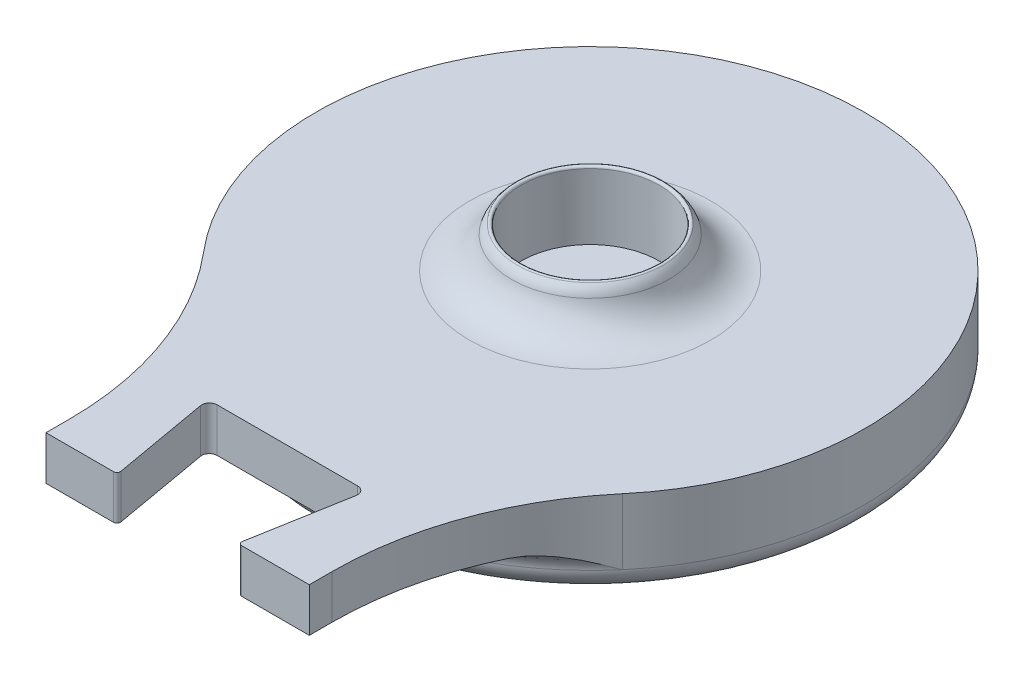
ISO-10303-21;
HEADER;
FILE_DESCRIPTION(('STEP AP214'),'2;1');
FILE_NAME('part.step','',(''),(''),'','','');
FILE_SCHEMA(('AUTOMOTIVE_DESIGN { 1 0 10303 214 1 1 1 1 }'));
ENDSEC;
DATA;
#1=APPLICATION_CONTEXT('core data for automotive mechanical design processes');
#2=APPLICATION_PROTOCOL_DEFINITION('international standard','automotive_design',2000,#1);
#3=PRODUCT_CONTEXT('',#1,'mechanical');
#4=PRODUCT('Part','Part','',(#3));
#5=PRODUCT_RELATED_PRODUCT_CATEGORY('part','',(#4));
#6=PRODUCT_DEFINITION_FORMATION('','',#4);
#7=PRODUCT_DEFINITION_CONTEXT('part definition',#1,'design');
#8=PRODUCT_DEFINITION('design','',#6,#7);
#9=PRODUCT_DEFINITION_SHAPE('','',#8);
#10=(LENGTH_UNIT() NAMED_UNIT(*) SI_UNIT(.MILLI.,.METRE.));
#11=(NAMED_UNIT(*) PLANE_ANGLE_UNIT() SI_UNIT($,.RADIAN.));
#12=(NAMED_UNIT(*) SI_UNIT($,.STERADIAN.) SOLID_ANGLE_UNIT());
#13=UNCERTAINTY_MEASURE_WITH_UNIT(LENGTH_MEASURE(1.E-05),#10,'distance_accuracy_value','');
#14=(GEOMETRIC_REPRESENTATION_CONTEXT(3) GLOBAL_UNCERTAINTY_ASSIGNED_CONTEXT((#13)) GLOBAL_UNIT_ASSIGNED_CONTEXT((#10,
#11,#12)) REPRESENTATION_CONTEXT('',''));
#15=CARTESIAN_POINT('',(0.,0.,0.));
#16=DIRECTION('',(0.,0.,1.));
#17=DIRECTION('',(1.,0.,0.));
#18=AXIS2_PLACEMENT_3D('',#15,#16,#17);
#19=CARTESIAN_POINT('',(0.,0.,0.));
#20=DIRECTION('',(0.,1.,0.));
#21=DIRECTION('',(0.,0.,1.));
#22=AXIS2_PLACEMENT_3D('',#19,#20,#21);
#23=PLANE('',#22);
#24=CARTESIAN_POINT('',(-21.,0.,17.7552809045647));
#25=DIRECTION('',(0.,1.,0.));
#26=DIRECTION('',(0.,0.,1.));
#27=AXIS2_PLACEMENT_3D('',#24,#25,#26);
#28=CIRCLE('',#27,15.);
#29=CARTESIAN_POINT('',(-6.,0.,17.7552809045647));
#30=VERTEX_POINT('',#29);
#31=CARTESIAN_POINT('',(-7.49425440352589,0.,11.2288089722478));
#32=VERTEX_POINT('',#31);
#33=EDGE_CURVE('E233',#30,#32,#28,.T.);
#34=ORIENTED_EDGE('',*,*,#33,.T.);
#35=CARTESIAN_POINT('',(0.,0.,0.));
#36=DIRECTION('',(0.,1.,0.));
#37=DIRECTION('',(0.,0.,1.));
#38=AXIS2_PLACEMENT_3D('',#35,#36,#37);
#39=CIRCLE('',#38,13.5);
#40=CARTESIAN_POINT('',(7.49425440352589,0.,11.2288089722478));
#41=VERTEX_POINT('',#40);
#42=EDGE_CURVE('E55',#32,#41,#39,.T.);
#43=ORIENTED_EDGE('',*,*,#42,.T.);
#44=CARTESIAN_POINT('',(21.,0.,17.7552809045647));
#45=DIRECTION('',(0.,1.,0.));
#46=DIRECTION('',(0.,0.,1.));
#47=AXIS2_PLACEMENT_3D('',#44,#45,#46);
#48=CIRCLE('',#47,15.);
#49=CARTESIAN_POINT('',(6.,0.,17.7552809045647));
#50=VERTEX_POINT('',#49);
#51=EDGE_CURVE('E237',#41,#50,#48,.T.);
#52=ORIENTED_EDGE('',*,*,#51,.T.);
#53=DIRECTION('',(0.,0.,-1.));
#54=VECTOR('',#53,1.);
#55=CARTESIAN_POINT('',(6.,0.,13.2915026221292));
#56=LINE('',#55,#54);
#57=CARTESIAN_POINT('',(6.,0.,18.8));
#58=VERTEX_POINT('',#57);
#59=EDGE_CURVE('E186',#58,#50,#56,.T.);
#60=ORIENTED_EDGE('',*,*,#59,.F.);
#61=DIRECTION('',(-1.,0.,0.));
#62=VECTOR('',#61,1.);
#63=CARTESIAN_POINT('',(0.,0.,18.8));
#64=LINE('',#63,#62);
#65=CARTESIAN_POINT('',(2.91630349460621,0.,18.8));
#66=VERTEX_POINT('',#65);
#67=EDGE_CURVE('E147',#58,#66,#64,.T.);
#68=ORIENTED_EDGE('',*,*,#67,.T.);
#69=CARTESIAN_POINT('',(2.91630349460621,0.,18.65));
#70=DIRECTION('',(0.,1.,0.));
#71=DIRECTION('',(0.,0.,1.));
#72=AXIS2_PLACEMENT_3D('',#69,#70,#71);
#73=CIRCLE('',#72,0.15);
#74=CARTESIAN_POINT('',(2.76858233165438,0.,18.62395277335));
#75=VERTEX_POINT('',#74);
#76=EDGE_CURVE('E219',#66,#75,#73,.F.);
#77=ORIENTED_EDGE('',*,*,#76,.T.);
#78=DIRECTION('',(-0.173648177666934,0.,0.984807753012207));
#79=VECTOR('',#78,1.);
#80=CARTESIAN_POINT('',(2.70227505957538,0.,19.));
#81=LINE('',#80,#79);
#82=CARTESIAN_POINT('',(3.54674431540572,0.,14.2107768621834));
#83=VERTEX_POINT('',#82);
#84=EDGE_CURVE('E183',#83,#75,#81,.T.);
#85=ORIENTED_EDGE('',*,*,#84,.F.);
#86=CARTESIAN_POINT('',(3.20206160185145,0.,14.15));
#87=DIRECTION('',(0.,1.,0.));
#88=DIRECTION('',(0.,0.,1.));
#89=AXIS2_PLACEMENT_3D('',#86,#87,#88);
#90=CIRCLE('',#89,0.35);
#91=CARTESIAN_POINT('',(3.20206160185145,0.,13.8));
#92=VERTEX_POINT('',#91);
#93=EDGE_CURVE('E200',#83,#92,#90,.T.);
#94=ORIENTED_EDGE('',*,*,#93,.T.);
#95=DIRECTION('',(1.,0.,0.));
#96=VECTOR('',#95,1.);
#97=CARTESIAN_POINT('',(3.61917535925942,0.,13.8));
#98=LINE('',#97,#96);
#99=CARTESIAN_POINT('',(-3.20206160185144,0.,13.8));
#100=VERTEX_POINT('',#99);
#101=EDGE_CURVE('E180',#100,#92,#98,.T.);
#102=ORIENTED_EDGE('',*,*,#101,.F.);
#103=CARTESIAN_POINT('',(-3.20206160185145,0.,14.15));
#104=DIRECTION('',(0.,1.,0.));
#105=DIRECTION('',(0.,0.,1.));
#106=AXIS2_PLACEMENT_3D('',#103,#104,#105);
#107=CIRCLE('',#106,0.35);
#108=CARTESIAN_POINT('',(-3.54674431540572,0.,14.2107768621834));
#109=VERTEX_POINT('',#108);
#110=EDGE_CURVE('E204',#100,#109,#107,.T.);
#111=ORIENTED_EDGE('',*,*,#110,.T.);
#112=DIRECTION('',(-0.173648177666935,0.,-0.984807753012207));
#113=VECTOR('',#112,1.);
#114=CARTESIAN_POINT('',(-2.70227505957538,0.,19.));
#115=LINE('',#114,#113);
#116=CARTESIAN_POINT('',(-2.76858233165438,0.,18.62395277335));
#117=VERTEX_POINT('',#116);
#118=EDGE_CURVE('E177',#117,#109,#115,.T.);
#119=ORIENTED_EDGE('',*,*,#118,.F.);
#120=CARTESIAN_POINT('',(-2.91630349460621,0.,18.65));
#121=DIRECTION('',(0.,1.,0.));
#122=DIRECTION('',(0.,0.,1.));
#123=AXIS2_PLACEMENT_3D('',#120,#121,#122);
#124=CIRCLE('',#123,0.15);
#125=CARTESIAN_POINT('',(-2.91630349460621,0.,18.8));
#126=VERTEX_POINT('',#125);
#127=EDGE_CURVE('E217',#117,#126,#124,.F.);
#128=ORIENTED_EDGE('',*,*,#127,.T.);
#129=CARTESIAN_POINT('',(-6.,0.,18.8));
#130=VERTEX_POINT('',#129);
#131=EDGE_CURVE('E166',#126,#130,#64,.T.);
#132=ORIENTED_EDGE('',*,*,#131,.T.);
#133=DIRECTION('',(0.,0.,1.));
#134=VECTOR('',#133,1.);
#135=CARTESIAN_POINT('',(-6.,0.,13.2915026221292));
#136=LINE('',#135,#134);
#137=EDGE_CURVE('E175',#30,#130,#136,.T.);
#138=ORIENTED_EDGE('',*,*,#137,.F.);
#139=EDGE_LOOP('',(#34,#43,#52,#60,#68,#77,#85,#94,#102,#111,#119,#128,#132,#138));
#140=FACE_BOUND('',#139,.T.);
#141=ADVANCED_FACE('F33',(#140),#23,.F.);
#142=CARTESIAN_POINT('',(0.,2.,0.));
#143=DIRECTION('',(0.,1.,0.));
#144=DIRECTION('',(0.,0.,1.));
#145=AXIS2_PLACEMENT_3D('',#142,#143,#144);
#146=PLANE('',#145);
#147=CARTESIAN_POINT('',(0.,2.,0.));
#148=DIRECTION('',(0.,1.,0.));
#149=DIRECTION('',(0.,0.,1.));
#150=AXIS2_PLACEMENT_3D('',#147,#148,#149);
#151=CIRCLE('',#150,5.5);
#152=CARTESIAN_POINT('',(0.,2.,5.5));
#153=VERTEX_POINT('',#152);
#154=EDGE_CURVE('E236',#153,#153,#151,.F.);
#155=ORIENTED_EDGE('',*,*,#154,.T.);
#156=EDGE_LOOP('',(#155));
#157=FACE_BOUND('',#156,.T.);
#158=DIRECTION('',(-0.173648177666934,0.,0.984807753012207));
#159=VECTOR('',#158,1.);
#160=CARTESIAN_POINT('',(2.70227505957538,2.,19.));
#161=LINE('',#160,#159);
#162=CARTESIAN_POINT('',(3.54674431540572,2.,14.2107768621834));
#163=VERTEX_POINT('',#162);
#164=CARTESIAN_POINT('',(2.76858233165438,2.,18.62395277335));
#165=VERTEX_POINT('',#164);
#166=EDGE_CURVE('E167',#163,#165,#161,.T.);
#167=ORIENTED_EDGE('',*,*,#166,.T.);
#168=CARTESIAN_POINT('',(2.91630349460621,2.,18.65));
#169=DIRECTION('',(0.,1.,0.));
#170=DIRECTION('',(0.,0.,1.));
#171=AXIS2_PLACEMENT_3D('',#168,#169,#170);
#172=CIRCLE('',#171,0.15);
#173=CARTESIAN_POINT('',(2.91630349460621,2.,18.8));
#174=VERTEX_POINT('',#173);
#175=EDGE_CURVE('E160',#165,#174,#172,.T.);
#176=ORIENTED_EDGE('',*,*,#175,.T.);
#177=DIRECTION('',(-1.,0.,0.));
#178=VECTOR('',#177,1.);
#179=CARTESIAN_POINT('',(-6.,2.,18.8));
#180=LINE('',#179,#178);
#181=CARTESIAN_POINT('',(6.,2.,18.8));
#182=VERTEX_POINT('',#181);
#183=EDGE_CURVE('E144',#182,#174,#180,.T.);
#184=ORIENTED_EDGE('',*,*,#183,.F.);
#185=DIRECTION('',(0.,0.,-1.));
#186=VECTOR('',#185,1.);
#187=CARTESIAN_POINT('',(6.,2.,19.));
#188=LINE('',#187,#186);
#189=CARTESIAN_POINT('',(6.,2.,17.7552809045647));
#190=VERTEX_POINT('',#189);
#191=EDGE_CURVE('E158',#182,#190,#188,.T.);
#192=ORIENTED_EDGE('',*,*,#191,.T.);
#193=CARTESIAN_POINT('',(21.,2.,17.7552809045647));
#194=DIRECTION('',(0.,1.,0.));
#195=DIRECTION('',(0.,0.,1.));
#196=AXIS2_PLACEMENT_3D('',#193,#194,#195);
#197=CIRCLE('',#196,15.);
#198=CARTESIAN_POINT('',(9.54545454545454,2.,8.0705822293476));
#199=VERTEX_POINT('',#198);
#200=EDGE_CURVE('E234',#190,#199,#197,.F.);
#201=ORIENTED_EDGE('',*,*,#200,.T.);
#202=CARTESIAN_POINT('',(0.,2.,0.));
#203=DIRECTION('',(0.,1.,0.));
#204=DIRECTION('',(0.,0.,1.));
#205=AXIS2_PLACEMENT_3D('',#202,#203,#204);
#206=CIRCLE('',#205,12.5);
#207=CARTESIAN_POINT('',(-9.54545454545454,2.,8.0705822293476));
#208=VERTEX_POINT('',#207);
#209=EDGE_CURVE('E178',#199,#208,#206,.T.);
#210=ORIENTED_EDGE('',*,*,#209,.T.);
#211=CARTESIAN_POINT('',(-21.,2.,17.7552809045647));
#212=DIRECTION('',(0.,1.,0.));
#213=DIRECTION('',(0.,0.,1.));
#214=AXIS2_PLACEMENT_3D('',#211,#212,#213);
#215=CIRCLE('',#214,15.);
#216=CARTESIAN_POINT('',(-6.,2.,17.7552809045647));
#217=VERTEX_POINT('',#216);
#218=EDGE_CURVE('E231',#208,#217,#215,.F.);
#219=ORIENTED_EDGE('',*,*,#218,.T.);
#220=DIRECTION('',(0.,0.,1.));
#221=VECTOR('',#220,1.);
#222=CARTESIAN_POINT('',(-6.,2.,-6.));
#223=LINE('',#222,#221);
#224=CARTESIAN_POINT('',(-6.,2.,18.8));
#225=VERTEX_POINT('',#224);
#226=EDGE_CURVE('E187',#217,#225,#223,.T.);
#227=ORIENTED_EDGE('',*,*,#226,.T.);
#228=CARTESIAN_POINT('',(-2.91630349460621,2.,18.8));
#229=VERTEX_POINT('',#228);
#230=EDGE_CURVE('E161',#229,#225,#180,.T.);
#231=ORIENTED_EDGE('',*,*,#230,.F.);
#232=CARTESIAN_POINT('',(-2.91630349460621,2.,18.65));
#233=DIRECTION('',(0.,1.,0.));
#234=DIRECTION('',(0.,0.,1.));
#235=AXIS2_PLACEMENT_3D('',#232,#233,#234);
#236=CIRCLE('',#235,0.15);
#237=CARTESIAN_POINT('',(-2.76858233165438,2.,18.62395277335));
#238=VERTEX_POINT('',#237);
#239=EDGE_CURVE('E212',#229,#238,#236,.T.);
#240=ORIENTED_EDGE('',*,*,#239,.T.);
#241=DIRECTION('',(-0.173648177666935,0.,-0.984807753012207));
#242=VECTOR('',#241,1.);
#243=CARTESIAN_POINT('',(-2.70227505957538,2.,19.));
#244=LINE('',#243,#242);
#245=CARTESIAN_POINT('',(-3.54674431540572,2.,14.2107768621834));
#246=VERTEX_POINT('',#245);
#247=EDGE_CURVE('E354',#238,#246,#244,.T.);
#248=ORIENTED_EDGE('',*,*,#247,.T.);
#249=CARTESIAN_POINT('',(-3.20206160185145,2.,14.15));
#250=DIRECTION('',(0.,1.,0.));
#251=DIRECTION('',(0.,0.,1.));
#252=AXIS2_PLACEMENT_3D('',#249,#250,#251);
#253=CIRCLE('',#252,0.35);
#254=CARTESIAN_POINT('',(-3.20206160185145,2.,13.8));
#255=VERTEX_POINT('',#254);
#256=EDGE_CURVE('E207',#246,#255,#253,.F.);
#257=ORIENTED_EDGE('',*,*,#256,.T.);
#258=DIRECTION('',(1.,0.,0.));
#259=VECTOR('',#258,1.);
#260=CARTESIAN_POINT('',(-3.61917535925942,2.,13.8));
#261=LINE('',#260,#259);
#262=CARTESIAN_POINT('',(3.20206160185144,2.,13.8));
#263=VERTEX_POINT('',#262);
#264=EDGE_CURVE('E171',#255,#263,#261,.T.);
#265=ORIENTED_EDGE('',*,*,#264,.T.);
#266=CARTESIAN_POINT('',(3.20206160185145,2.,14.15));
#267=DIRECTION('',(0.,1.,0.));
#268=DIRECTION('',(0.,0.,1.));
#269=AXIS2_PLACEMENT_3D('',#266,#267,#268);
#270=CIRCLE('',#269,0.35);
#271=EDGE_CURVE('E202',#263,#163,#270,.F.);
#272=ORIENTED_EDGE('',*,*,#271,.T.);
#273=EDGE_LOOP('',(#167,#176,#184,#192,#201,#210,#219,#227,#231,#240,#248,#257,#265,#272));
#274=FACE_BOUND('',#273,.T.);
#275=ADVANCED_FACE('F157',(#157,#274),#146,.T.);
#276=CARTESIAN_POINT('',(-6.,2.,13.2915026221292));
#277=DIRECTION('',(1.,0.,0.));
#278=DIRECTION('',(0.,0.,-1.));
#279=AXIS2_PLACEMENT_3D('',#276,#277,#278);
#280=PLANE('',#279);
#281=ORIENTED_EDGE('',*,*,#226,.F.);
#282=DIRECTION('',(0.,1.,0.));
#283=VECTOR('',#282,1.);
#284=CARTESIAN_POINT('',(-6.,0.,17.7552809045647));
#285=LINE('',#284,#283);
#286=EDGE_CURVE('E227',#217,#30,#285,.F.);
#287=ORIENTED_EDGE('',*,*,#286,.T.);
#288=ORIENTED_EDGE('',*,*,#137,.T.);
#289=DIRECTION('',(0.,1.,0.));
#290=VECTOR('',#289,1.);
#291=CARTESIAN_POINT('',(-6.,-2.,18.8));
#292=LINE('',#291,#290);
#293=EDGE_CURVE('E152',#130,#225,#292,.T.);
#294=ORIENTED_EDGE('',*,*,#293,.T.);
#295=EDGE_LOOP('',(#281,#287,#288,#294));
#296=FACE_BOUND('',#295,.T.);
#297=ADVANCED_FACE('F316',(#296),#280,.F.);
#298=CARTESIAN_POINT('',(6.,2.,13.2915026221292));
#299=DIRECTION('',(-1.,0.,0.));
#300=DIRECTION('',(0.,0.,1.));
#301=AXIS2_PLACEMENT_3D('',#298,#299,#300);
#302=PLANE('',#301);
#303=ORIENTED_EDGE('',*,*,#59,.T.);
#304=DIRECTION('',(0.,1.,0.));
#305=VECTOR('',#304,1.);
#306=CARTESIAN_POINT('',(6.,2.,17.7552809045647));
#307=LINE('',#306,#305);
#308=EDGE_CURVE('E165',#50,#190,#307,.T.);
#309=ORIENTED_EDGE('',*,*,#308,.T.);
#310=ORIENTED_EDGE('',*,*,#191,.F.);
#311=DIRECTION('',(0.,1.,0.));
#312=VECTOR('',#311,1.);
#313=CARTESIAN_POINT('',(6.,-2.,18.8));
#314=LINE('',#313,#312);
#315=EDGE_CURVE('E141',#58,#182,#314,.T.);
#316=ORIENTED_EDGE('',*,*,#315,.F.);
#317=EDGE_LOOP('',(#303,#309,#310,#316));
#318=FACE_BOUND('',#317,.T.);
#319=ADVANCED_FACE('F163',(#318),#302,.F.);
#320=CARTESIAN_POINT('',(-2.70227505957538,2.,19.));
#321=DIRECTION('',(-0.984807753012207,0.,0.173648177666935));
#322=DIRECTION('',(0.173648177666935,0.,0.984807753012207));
#323=AXIS2_PLACEMENT_3D('',#320,#321,#322);
#324=PLANE('',#323);
#325=ORIENTED_EDGE('',*,*,#247,.F.);
#326=DIRECTION('',(0.,-1.,0.));
#327=VECTOR('',#326,1.);
#328=CARTESIAN_POINT('',(-2.76858233165438,2.,18.62395277335));
#329=LINE('',#328,#327);
#330=EDGE_CURVE('E221',#238,#117,#329,.T.);
#331=ORIENTED_EDGE('',*,*,#330,.T.);
#332=ORIENTED_EDGE('',*,*,#118,.T.);
#333=DIRECTION('',(0.,-1.,0.));
#334=VECTOR('',#333,1.);
#335=CARTESIAN_POINT('',(-3.54674431540572,2.,14.2107768621834));
#336=LINE('',#335,#334);
#337=EDGE_CURVE('E197',#109,#246,#336,.F.);
#338=ORIENTED_EDGE('',*,*,#337,.T.);
#339=EDGE_LOOP('',(#325,#331,#332,#338));
#340=FACE_BOUND('',#339,.T.);
#341=ADVANCED_FACE('F389',(#340),#324,.F.);
#342=CARTESIAN_POINT('',(3.61917535925942,2.,13.8));
#343=DIRECTION('',(0.,0.,-1.));
#344=DIRECTION('',(-1.,0.,0.));
#345=AXIS2_PLACEMENT_3D('',#342,#343,#344);
#346=PLANE('',#345);
#347=ORIENTED_EDGE('',*,*,#101,.T.);
#348=DIRECTION('',(0.,-1.,0.));
#349=VECTOR('',#348,1.);
#350=CARTESIAN_POINT('',(3.20206160185145,2.,13.8));
#351=LINE('',#350,#349);
#352=EDGE_CURVE('E195',#92,#263,#351,.F.);
#353=ORIENTED_EDGE('',*,*,#352,.T.);
#354=ORIENTED_EDGE('',*,*,#264,.F.);
#355=DIRECTION('',(0.,-1.,0.));
#356=VECTOR('',#355,1.);
#357=CARTESIAN_POINT('',(-3.20206160185145,0.,13.8));
#358=LINE('',#357,#356);
#359=EDGE_CURVE('E192',#255,#100,#358,.T.);
#360=ORIENTED_EDGE('',*,*,#359,.T.);
#361=EDGE_LOOP('',(#347,#353,#354,#360));
#362=FACE_BOUND('',#361,.T.);
#363=ADVANCED_FACE('F392',(#362),#346,.F.);
#364=CARTESIAN_POINT('',(2.70227505957538,2.,19.));
#365=DIRECTION('',(0.984807753012207,0.,0.173648177666934));
#366=DIRECTION('',(0.173648177666934,0.,-0.984807753012207));
#367=AXIS2_PLACEMENT_3D('',#364,#365,#366);
#368=PLANE('',#367);
#369=ORIENTED_EDGE('',*,*,#84,.T.);
#370=DIRECTION('',(0.,1.,0.));
#371=VECTOR('',#370,1.);
#372=CARTESIAN_POINT('',(2.76858233165438,2.,18.62395277335));
#373=LINE('',#372,#371);
#374=EDGE_CURVE('E209',#75,#165,#373,.T.);
#375=ORIENTED_EDGE('',*,*,#374,.T.);
#376=ORIENTED_EDGE('',*,*,#166,.F.);
#377=DIRECTION('',(0.,-1.,0.));
#378=VECTOR('',#377,1.);
#379=CARTESIAN_POINT('',(3.54674431540572,0.,14.2107768621834));
#380=LINE('',#379,#378);
#381=EDGE_CURVE('E189',#163,#83,#380,.T.);
#382=ORIENTED_EDGE('',*,*,#381,.T.);
#383=EDGE_LOOP('',(#369,#375,#376,#382));
#384=FACE_BOUND('',#383,.T.);
#385=ADVANCED_FACE('F368',(#384),#368,.F.);
#386=CARTESIAN_POINT('',(0.,2.,0.));
#387=DIRECTION('',(0.,-1.,0.));
#388=DIRECTION('',(0.,0.,-1.));
#389=AXIS2_PLACEMENT_3D('',#386,#387,#388);
#390=CYLINDRICAL_SURFACE('',#389,12.5);
#391=DIRECTION('',(0.,-1.,0.));
#392=VECTOR('',#391,1.);
#393=CARTESIAN_POINT('',(9.54545454545454,2.,8.0705822293476));
#394=LINE('',#393,#392);
#395=CARTESIAN_POINT('',(9.54545454545454,-1.,8.0705822293476));
#396=VERTEX_POINT('',#395);
#397=EDGE_CURVE('E226',#199,#396,#394,.T.);
#398=ORIENTED_EDGE('',*,*,#397,.T.);
#399=CARTESIAN_POINT('',(0.,-1.,0.));
#400=DIRECTION('',(0.,-1.,0.));
#401=DIRECTION('',(0.,0.,-1.));
#402=AXIS2_PLACEMENT_3D('',#399,#400,#401);
#403=CIRCLE('',#402,12.5);
#404=CARTESIAN_POINT('',(-9.54545454545454,-1.,8.0705822293476));
#405=VERTEX_POINT('',#404);
#406=EDGE_CURVE('E11',#396,#405,#403,.F.);
#407=ORIENTED_EDGE('',*,*,#406,.T.);
#408=DIRECTION('',(0.,-1.,0.));
#409=VECTOR('',#408,1.);
#410=CARTESIAN_POINT('',(-9.54545454545454,2.,8.0705822293476));
#411=LINE('',#410,#409);
#412=EDGE_CURVE('E229',#405,#208,#411,.F.);
#413=ORIENTED_EDGE('',*,*,#412,.T.);
#414=ORIENTED_EDGE('',*,*,#209,.F.);
#415=EDGE_LOOP('',(#398,#407,#413,#414));
#416=FACE_BOUND('',#415,.T.);
#417=ADVANCED_FACE('F397',(#416),#390,.T.);
#418=CARTESIAN_POINT('',(-6.,-2.,18.8));
#419=DIRECTION('',(0.,0.,-1.));
#420=DIRECTION('',(-1.,0.,0.));
#421=AXIS2_PLACEMENT_3D('',#418,#419,#420);
#422=PLANE('',#421);
#423=ORIENTED_EDGE('',*,*,#131,.F.);
#424=DIRECTION('',(0.,-1.,0.));
#425=VECTOR('',#424,1.);
#426=CARTESIAN_POINT('',(-2.91630349460621,-2.,18.8));
#427=LINE('',#426,#425);
#428=EDGE_CURVE('E224',#126,#229,#427,.F.);
#429=ORIENTED_EDGE('',*,*,#428,.T.);
#430=ORIENTED_EDGE('',*,*,#230,.T.);
#431=ORIENTED_EDGE('',*,*,#293,.F.);
#432=EDGE_LOOP('',(#423,#429,#430,#431));
#433=FACE_BOUND('',#432,.T.);
#434=ADVANCED_FACE('F425',(#433),#422,.F.);
#435=ORIENTED_EDGE('',*,*,#183,.T.);
#436=DIRECTION('',(0.,1.,0.));
#437=VECTOR('',#436,1.);
#438=CARTESIAN_POINT('',(2.91630349460621,-2.,18.8));
#439=LINE('',#438,#437);
#440=EDGE_CURVE('E215',#174,#66,#439,.F.);
#441=ORIENTED_EDGE('',*,*,#440,.T.);
#442=ORIENTED_EDGE('',*,*,#67,.F.);
#443=ORIENTED_EDGE('',*,*,#315,.T.);
#444=EDGE_LOOP('',(#435,#441,#442,#443));
#445=FACE_BOUND('',#444,.T.);
#446=ADVANCED_FACE('F143',(#445),#422,.F.);
#447=CARTESIAN_POINT('',(3.20206160185145,2.,14.15));
#448=DIRECTION('',(0.,1.,0.));
#449=DIRECTION('',(0.,0.,1.));
#450=AXIS2_PLACEMENT_3D('',#447,#448,#449);
#451=CYLINDRICAL_SURFACE('',#450,0.35);
#452=ORIENTED_EDGE('',*,*,#271,.F.);
#453=ORIENTED_EDGE('',*,*,#352,.F.);
#454=ORIENTED_EDGE('',*,*,#93,.F.);
#455=ORIENTED_EDGE('',*,*,#381,.F.);
#456=EDGE_LOOP('',(#452,#453,#454,#455));
#457=FACE_BOUND('',#456,.T.);
#458=ADVANCED_FACE('F365',(#457),#451,.F.);
#459=CARTESIAN_POINT('',(-3.20206160185145,2.,14.15));
#460=DIRECTION('',(0.,1.,0.));
#461=DIRECTION('',(0.,0.,1.));
#462=AXIS2_PLACEMENT_3D('',#459,#460,#461);
#463=CYLINDRICAL_SURFACE('',#462,0.35);
#464=ORIENTED_EDGE('',*,*,#256,.F.);
#465=ORIENTED_EDGE('',*,*,#337,.F.);
#466=ORIENTED_EDGE('',*,*,#110,.F.);
#467=ORIENTED_EDGE('',*,*,#359,.F.);
#468=EDGE_LOOP('',(#464,#465,#466,#467));
#469=FACE_BOUND('',#468,.T.);
#470=ADVANCED_FACE('F375',(#469),#463,.F.);
#471=CARTESIAN_POINT('',(2.91630349460621,2.,18.65));
#472=DIRECTION('',(0.,1.,0.));
#473=DIRECTION('',(0.,0.,1.));
#474=AXIS2_PLACEMENT_3D('',#471,#472,#473);
#475=CYLINDRICAL_SURFACE('',#474,0.15);
#476=ORIENTED_EDGE('',*,*,#76,.F.);
#477=ORIENTED_EDGE('',*,*,#440,.F.);
#478=ORIENTED_EDGE('',*,*,#175,.F.);
#479=ORIENTED_EDGE('',*,*,#374,.F.);
#480=EDGE_LOOP('',(#476,#477,#478,#479));
#481=FACE_BOUND('',#480,.T.);
#482=ADVANCED_FACE('F373',(#481),#475,.T.);
#483=CARTESIAN_POINT('',(-2.91630349460621,2.,18.65));
#484=DIRECTION('',(0.,-1.,0.));
#485=DIRECTION('',(0.,0.,-1.));
#486=AXIS2_PLACEMENT_3D('',#483,#484,#485);
#487=CYLINDRICAL_SURFACE('',#486,0.15);
#488=ORIENTED_EDGE('',*,*,#239,.F.);
#489=ORIENTED_EDGE('',*,*,#428,.F.);
#490=ORIENTED_EDGE('',*,*,#127,.F.);
#491=ORIENTED_EDGE('',*,*,#330,.F.);
#492=EDGE_LOOP('',(#488,#489,#490,#491));
#493=FACE_BOUND('',#492,.T.);
#494=ADVANCED_FACE('F283',(#493),#487,.T.);
#495=CARTESIAN_POINT('',(-21.,2.,17.7552809045647));
#496=DIRECTION('',(0.,-1.,0.));
#497=DIRECTION('',(0.,0.,-1.));
#498=AXIS2_PLACEMENT_3D('',#495,#496,#497);
#499=CYLINDRICAL_SURFACE('',#498,15.);
#500=ORIENTED_EDGE('',*,*,#33,.F.);
#501=ORIENTED_EDGE('',*,*,#286,.F.);
#502=ORIENTED_EDGE('',*,*,#218,.F.);
#503=ORIENTED_EDGE('',*,*,#412,.F.);
#504=CARTESIAN_POINT('',(-7.49425440352589,0.,11.2288089722478));
#505=CARTESIAN_POINT('',(-7.52464465109431,-1.29678514643632E-05,11.1659172127695));
#506=CARTESIAN_POINT('',(-7.55546630580481,-0.00188328280275673,11.1032595472718));
#507=CARTESIAN_POINT('',(-7.61788842155556,-0.00891103926004141,10.9785605699075));
#508=CARTESIAN_POINT('',(-7.64948842480095,-0.0140665908949063,10.9165189244935));
#509=CARTESIAN_POINT('',(-7.713335801682,-0.0272212465326925,10.7932868609423));
#510=CARTESIAN_POINT('',(-7.74558129365242,-0.0352129759314562,10.7320946588871));
#511=CARTESIAN_POINT('',(-7.81075610879212,-0.0537004941474484,10.610450054442));
#512=CARTESIAN_POINT('',(-7.84368554143399,-0.0641966866971036,10.5499977729846));
#513=CARTESIAN_POINT('',(-7.94290818692698,-0.0987926148034731,10.3707768320217));
#514=CARTESIAN_POINT('',(-8.01015160682364,-0.126116215052921,10.2531497142536));
#515=CARTESIAN_POINT('',(-8.14701935714824,-0.187481903423415,10.0210021686831));
#516=CARTESIAN_POINT('',(-8.21664551502184,-0.221529248332566,9.90648425192594));
#517=CARTESIAN_POINT('',(-8.38305532833876,-0.307704368028521,9.64077558902714));
#518=CARTESIAN_POINT('',(-8.48077083809506,-0.361977683422389,9.49086649216762));
#519=CARTESIAN_POINT('',(-8.68022241965111,-0.476991510288998,9.19638577156314));
#520=CARTESIAN_POINT('',(-8.78195828339278,-0.53773168736889,9.05181387235888));
#521=CARTESIAN_POINT('',(-9.09374220928522,-0.726269159772974,8.62480296592956));
#522=CARTESIAN_POINT('',(-9.31004536674453,-0.860199645486421,8.34957923530553));
#523=CARTESIAN_POINT('',(-9.53881841355236,-0.996062536116522,8.0784352068804));
#524=CARTESIAN_POINT('',(-9.54213548854836,-0.99803128502951,8.07450785489815));
#525=CARTESIAN_POINT('',(-9.54545454545455,-1.,8.07058222934759));
#526=B_SPLINE_CURVE_WITH_KNOTS('',3,(#504,#505,#506,#507,#508,#509,#510,#511,#512,#513,#514,
#515,#516,#517,#518,#519,#520,#521,#522,#523,#524,#525),.UNSPECIFIED.,.F.,.F.,(4,2,2,2,2,2,2,2,
2,2,4),(0.,0.209488757796817,0.418857113375514,0.627685012527229,0.836546598588415,
1.25089896459534,1.66557657316446,2.22623256225176,2.78685957462782,3.90999938141366,
3.92651383979361),.UNSPECIFIED.);
#527=EDGE_CURVE('E48',#405,#32,#526,.F.);
#528=ORIENTED_EDGE('',*,*,#527,.T.);
#529=EDGE_LOOP('',(#500,#501,#502,#503,#528));
#530=FACE_BOUND('',#529,.T.);
#531=ADVANCED_FACE('F278',(#530),#499,.F.);
#532=CARTESIAN_POINT('',(21.,2.,17.7552809045647));
#533=DIRECTION('',(0.,-1.,0.));
#534=DIRECTION('',(0.,0.,-1.));
#535=AXIS2_PLACEMENT_3D('',#532,#533,#534);
#536=CYLINDRICAL_SURFACE('',#535,15.);
#537=ORIENTED_EDGE('',*,*,#200,.F.);
#538=ORIENTED_EDGE('',*,*,#308,.F.);
#539=ORIENTED_EDGE('',*,*,#51,.F.);
#540=CARTESIAN_POINT('',(7.49425440352589,0.,11.2288089722478));
#541=CARTESIAN_POINT('',(7.52464465109431,-1.29678514643632E-05,11.1659172127695));
#542=CARTESIAN_POINT('',(7.55546630580481,-0.00188328280275673,11.1032595472718));
#543=CARTESIAN_POINT('',(7.61788842155556,-0.00891103926004141,10.9785605699075));
#544=CARTESIAN_POINT('',(7.64948842480095,-0.0140665908949063,10.9165189244935));
#545=CARTESIAN_POINT('',(7.713335801682,-0.0272212465326925,10.7932868609423));
#546=CARTESIAN_POINT('',(7.74558129365242,-0.0352129759314562,10.7320946588871));
#547=CARTESIAN_POINT('',(7.81075610879212,-0.0537004941474484,10.610450054442));
#548=CARTESIAN_POINT('',(7.84368554143399,-0.0641966866971036,10.5499977729846));
#549=CARTESIAN_POINT('',(7.94290818692698,-0.0987926148034731,10.3707768320217));
#550=CARTESIAN_POINT('',(8.01015160682364,-0.126116215052921,10.2531497142536));
#551=CARTESIAN_POINT('',(8.14701935714824,-0.187481903423415,10.0210021686831));
#552=CARTESIAN_POINT('',(8.21664551502184,-0.221529248332566,9.90648425192594));
#553=CARTESIAN_POINT('',(8.38305532833876,-0.307704368028521,9.64077558902714));
#554=CARTESIAN_POINT('',(8.48077083809506,-0.361977683422389,9.49086649216762));
#555=CARTESIAN_POINT('',(8.68022241965111,-0.476991510288998,9.19638577156314));
#556=CARTESIAN_POINT('',(8.78195828339278,-0.53773168736889,9.05181387235888));
#557=CARTESIAN_POINT('',(9.09374220928522,-0.726269159772974,8.62480296592956));
#558=CARTESIAN_POINT('',(9.31004536674453,-0.860199645486421,8.34957923530553));
#559=CARTESIAN_POINT('',(9.53881841355236,-0.996062536116522,8.0784352068804));
#560=CARTESIAN_POINT('',(9.54213548854836,-0.99803128502951,8.07450785489815));
#561=CARTESIAN_POINT('',(9.54545454545455,-1.,8.07058222934759));
#562=B_SPLINE_CURVE_WITH_KNOTS('',3,(#540,#541,#542,#543,#544,#545,#546,#547,#548,#549,#550,
#551,#552,#553,#554,#555,#556,#557,#558,#559,#560,#561),.UNSPECIFIED.,.F.,.F.,(4,2,2,2,2,2,2,2,
2,2,4),(0.,0.209488757796817,0.418857113375514,0.627685012527229,0.836546598588415,
1.25089896459534,1.66557657316446,2.22623256225176,2.78685957462782,3.90999938141366,
3.92651383979361),.UNSPECIFIED.);
#563=EDGE_CURVE('E270',#41,#396,#562,.T.);
#564=ORIENTED_EDGE('',*,*,#563,.T.);
#565=ORIENTED_EDGE('',*,*,#397,.F.);
#566=EDGE_LOOP('',(#537,#538,#539,#564,#565));
#567=FACE_BOUND('',#566,.T.);
#568=ADVANCED_FACE('F282',(#567),#536,.F.);
#569=CARTESIAN_POINT('',(0.,0.8,0.));
#570=DIRECTION('',(0.,1.,0.));
#571=DIRECTION('',(0.,0.,1.));
#572=AXIS2_PLACEMENT_3D('',#569,#570,#571);
#573=CYLINDRICAL_SURFACE('',#572,3.15);
#574=CARTESIAN_POINT('',(0.,3.79574537668253,0.));
#575=DIRECTION('',(0.,-1.,0.));
#576=DIRECTION('',(0.,0.,-1.));
#577=AXIS2_PLACEMENT_3D('',#574,#575,#576);
#578=CIRCLE('',#577,3.15);
#579=CARTESIAN_POINT('',(0.,3.79574537668253,-3.15));
#580=VERTEX_POINT('',#579);
#581=EDGE_CURVE('E243',#580,#580,#578,.F.);
#582=ORIENTED_EDGE('',*,*,#581,.T.);
#583=EDGE_LOOP('',(#582));
#584=FACE_BOUND('',#583,.T.);
#585=CARTESIAN_POINT('',(0.,0.8,0.));
#586=DIRECTION('',(0.,1.,0.));
#587=DIRECTION('',(0.,0.,1.));
#588=AXIS2_PLACEMENT_3D('',#585,#586,#587);
#589=CIRCLE('',#588,3.15);
#590=CARTESIAN_POINT('',(0.,0.8,3.15));
#591=VERTEX_POINT('',#590);
#592=EDGE_CURVE('E342',#591,#591,#589,.T.);
#593=ORIENTED_EDGE('',*,*,#592,.F.);
#594=EDGE_LOOP('',(#593));
#595=FACE_BOUND('',#594,.T.);
#596=ADVANCED_FACE('F288',(#584,#595),#573,.F.);
#597=CARTESIAN_POINT('',(0.,0.8,0.));
#598=DIRECTION('',(0.,1.,0.));
#599=DIRECTION('',(0.,0.,1.));
#600=AXIS2_PLACEMENT_3D('',#597,#598,#599);
#601=PLANE('',#600);
#602=CARTESIAN_POINT('',(0.,0.8,0.));
#603=DIRECTION('',(0.,1.,0.));
#604=DIRECTION('',(0.,0.,1.));
#605=AXIS2_PLACEMENT_3D('',#602,#603,#604);
#606=CIRCLE('',#605,0.3);
#607=CARTESIAN_POINT('',(0.,0.8,0.3));
#608=VERTEX_POINT('',#607);
#609=EDGE_CURVE('E344',#608,#608,#606,.T.);
#610=ORIENTED_EDGE('',*,*,#609,.F.);
#611=EDGE_LOOP('',(#610));
#612=FACE_BOUND('',#611,.T.);
#613=ORIENTED_EDGE('',*,*,#592,.T.);
#614=EDGE_LOOP('',(#613));
#615=FACE_BOUND('',#614,.T.);
#616=ADVANCED_FACE('F294',(#612,#615),#601,.T.);
#617=CARTESIAN_POINT('',(0.,4.,0.));
#618=DIRECTION('',(0.,1.,0.));
#619=DIRECTION('',(0.,0.,1.));
#620=AXIS2_PLACEMENT_3D('',#617,#618,#619);
#621=TOROIDAL_SURFACE('',#620,5.5,2.);
#622=CARTESIAN_POINT('',(0.,3.4334759275443,0.));
#623=DIRECTION('',(0.,1.,0.));
#624=DIRECTION('',(0.,0.,1.));
#625=AXIS2_PLACEMENT_3D('',#622,#623,#624);
#626=CIRCLE('',#625,3.58191489361702);
#627=CARTESIAN_POINT('',(0.,3.4334759275443,3.58191489361702));
#628=VERTEX_POINT('',#627);
#629=EDGE_CURVE('E240',#628,#628,#626,.F.);
#630=ORIENTED_EDGE('',*,*,#629,.T.);
#631=EDGE_LOOP('',(#630));
#632=FACE_BOUND('',#631,.T.);
#633=ORIENTED_EDGE('',*,*,#154,.F.);
#634=EDGE_LOOP('',(#633));
#635=FACE_BOUND('',#634,.T.);
#636=ADVANCED_FACE('F290',(#632,#635),#621,.F.);
#637=CARTESIAN_POINT('',(0.,3.15021389131644,0.));
#638=DIRECTION('',(0.,1.,0.));
#639=DIRECTION('',(0.,0.,1.));
#640=AXIS2_PLACEMENT_3D('',#637,#638,#639);
#641=TOROIDAL_SURFACE('',#640,2.62287234042553,1.);
#642=CARTESIAN_POINT('',(0.,3.86747109727808,0.));
#643=DIRECTION('',(0.,-1.,0.));
#644=DIRECTION('',(0.,0.,-1.));
#645=AXIS2_PLACEMENT_3D('',#642,#643,#644);
#646=CIRCLE('',#645,3.3196808510625);
#647=CARTESIAN_POINT('',(0.,3.86747109727808,-3.3196808510625));
#648=VERTEX_POINT('',#647);
#649=EDGE_CURVE('E246',#648,#648,#646,.T.);
#650=ORIENTED_EDGE('',*,*,#649,.T.);
#651=EDGE_LOOP('',(#650));
#652=FACE_BOUND('',#651,.T.);
#653=ORIENTED_EDGE('',*,*,#629,.F.);
#654=EDGE_LOOP('',(#653));
#655=FACE_BOUND('',#654,.T.);
#656=ADVANCED_FACE('F293',(#652,#655),#641,.T.);
#657=CARTESIAN_POINT('',(0.,3.79574537668253,0.));
#658=DIRECTION('',(0.,-1.,0.));
#659=DIRECTION('',(0.,0.,-1.));
#660=AXIS2_PLACEMENT_3D('',#657,#658,#659);
#661=TOROIDAL_SURFACE('',#660,3.2499999999994,0.1);
#662=ORIENTED_EDGE('',*,*,#649,.F.);
#663=EDGE_LOOP('',(#662));
#664=FACE_BOUND('',#663,.T.);
#665=ORIENTED_EDGE('',*,*,#581,.F.);
#666=EDGE_LOOP('',(#665));
#667=FACE_BOUND('',#666,.T.);
#668=ADVANCED_FACE('F297',(#664,#667),#661,.T.);
#669=CARTESIAN_POINT('',(0.,-2.,0.));
#670=DIRECTION('',(0.,-1.,0.));
#671=DIRECTION('',(0.,0.,-1.));
#672=AXIS2_PLACEMENT_3D('',#669,#670,#671);
#673=PLANE('',#672);
#674=CARTESIAN_POINT('',(0.,-2.,0.));
#675=DIRECTION('',(0.,-1.,0.));
#676=DIRECTION('',(0.,0.,-1.));
#677=AXIS2_PLACEMENT_3D('',#674,#675,#676);
#678=CIRCLE('',#677,11.5);
#679=CARTESIAN_POINT('',(0.,-2.,-11.5));
#680=VERTEX_POINT('',#679);
#681=EDGE_CURVE('E41',#680,#680,#678,.T.);
#682=ORIENTED_EDGE('',*,*,#681,.T.);
#683=EDGE_LOOP('',(#682));
#684=FACE_BOUND('',#683,.T.);
#685=CARTESIAN_POINT('',(0.,-2.,0.));
#686=DIRECTION('',(0.,-1.,0.));
#687=DIRECTION('',(0.,0.,-1.));
#688=AXIS2_PLACEMENT_3D('',#685,#686,#687);
#689=CIRCLE('',#688,10.5);
#690=CARTESIAN_POINT('',(0.,-2.,-10.5));
#691=VERTEX_POINT('',#690);
#692=EDGE_CURVE('E339',#691,#691,#689,.T.);
#693=ORIENTED_EDGE('',*,*,#692,.F.);
#694=EDGE_LOOP('',(#693));
#695=FACE_BOUND('',#694,.T.);
#696=ADVANCED_FACE('F300',(#684,#695),#673,.T.);
#697=CARTESIAN_POINT('',(0.,-2.,0.));
#698=DIRECTION('',(0.,1.,0.));
#699=DIRECTION('',(0.,0.,1.));
#700=AXIS2_PLACEMENT_3D('',#697,#698,#699);
#701=CYLINDRICAL_SURFACE('',#700,10.5);
#702=ORIENTED_EDGE('',*,*,#692,.T.);
#703=EDGE_LOOP('',(#702));
#704=FACE_BOUND('',#703,.T.);
#705=CARTESIAN_POINT('',(0.,0.,0.));
#706=DIRECTION('',(0.,-1.,0.));
#707=DIRECTION('',(0.,0.,-1.));
#708=AXIS2_PLACEMENT_3D('',#705,#706,#707);
#709=CIRCLE('',#708,10.5);
#710=CARTESIAN_POINT('',(0.,0.,-10.5));
#711=VERTEX_POINT('',#710);
#712=EDGE_CURVE('E337',#711,#711,#709,.T.);
#713=ORIENTED_EDGE('',*,*,#712,.F.);
#714=EDGE_LOOP('',(#713));
#715=FACE_BOUND('',#714,.T.);
#716=ADVANCED_FACE('F305',(#704,#715),#701,.F.);
#717=CARTESIAN_POINT('',(0.,0.,0.));
#718=DIRECTION('',(0.,1.,0.));
#719=DIRECTION('',(0.,0.,1.));
#720=AXIS2_PLACEMENT_3D('',#717,#718,#719);
#721=CIRCLE('',#720,0.3);
#722=CARTESIAN_POINT('',(0.,0.,0.3));
#723=VERTEX_POINT('',#722);
#724=EDGE_CURVE('E334',#723,#723,#721,.T.);
#725=ORIENTED_EDGE('',*,*,#724,.T.);
#726=EDGE_LOOP('',(#725));
#727=FACE_BOUND('',#726,.T.);
#728=ORIENTED_EDGE('',*,*,#712,.T.);
#729=EDGE_LOOP('',(#728));
#730=FACE_BOUND('',#729,.T.);
#731=ADVANCED_FACE('F312',(#727,#730),#23,.F.);
#732=CARTESIAN_POINT('',(0.,-1.2,0.));
#733=DIRECTION('',(0.,1.,0.));
#734=DIRECTION('',(0.,0.,1.));
#735=AXIS2_PLACEMENT_3D('',#732,#733,#734);
#736=CYLINDRICAL_SURFACE('',#735,0.3);
#737=ORIENTED_EDGE('',*,*,#609,.T.);
#738=EDGE_LOOP('',(#737));
#739=FACE_BOUND('',#738,.T.);
#740=ORIENTED_EDGE('',*,*,#724,.F.);
#741=EDGE_LOOP('',(#740));
#742=FACE_BOUND('',#741,.T.);
#743=ADVANCED_FACE('F321',(#739,#742),#736,.F.);
#744=CARTESIAN_POINT('',(0.,-1.,0.));
#745=DIRECTION('',(0.,1.,0.));
#746=DIRECTION('',(0.,0.,1.));
#747=AXIS2_PLACEMENT_3D('',#744,#745,#746);
#748=TOROIDAL_SURFACE('',#747,13.5,1.);
#749=ORIENTED_EDGE('',*,*,#563,.F.);
#750=ORIENTED_EDGE('',*,*,#42,.F.);
#751=ORIENTED_EDGE('',*,*,#527,.F.);
#752=CARTESIAN_POINT('',(0.,-1.,0.));
#753=DIRECTION('',(0.,1.,0.));
#754=DIRECTION('',(0.,0.,1.));
#755=AXIS2_PLACEMENT_3D('',#752,#753,#754);
#756=CIRCLE('',#755,12.5);
#757=EDGE_CURVE('E249',#396,#405,#756,.F.);
#758=ORIENTED_EDGE('',*,*,#757,.F.);
#759=EDGE_LOOP('',(#749,#750,#751,#758));
#760=FACE_BOUND('',#759,.T.);
#761=ADVANCED_FACE('F275',(#760),#748,.F.);
#762=CARTESIAN_POINT('',(0.,-1.,0.));
#763=DIRECTION('',(0.,-1.,0.));
#764=DIRECTION('',(0.,0.,-1.));
#765=AXIS2_PLACEMENT_3D('',#762,#763,#764);
#766=TOROIDAL_SURFACE('',#765,11.5,1.);
#767=ORIENTED_EDGE('',*,*,#406,.F.);
#768=ORIENTED_EDGE('',*,*,#757,.T.);
#769=EDGE_LOOP('',(#767,#768));
#770=FACE_BOUND('',#769,.T.);
#771=ORIENTED_EDGE('',*,*,#681,.F.);
#772=EDGE_LOOP('',(#771));
#773=FACE_BOUND('',#772,.T.);
#774=ADVANCED_FACE('F35',(#770,#773),#766,.T.);
#775=CLOSED_SHELL('',(#141,#275,#297,#319,#341,#363,#385,#417,#434,#446,#458,#470,#482,#494,
#531,#568,#596,#616,#636,#656,#668,#696,#716,#731,#743,#761,#774));
#776=MANIFOLD_SOLID_BREP('B2',#775);
#777=ADVANCED_BREP_SHAPE_REPRESENTATION('',(#18,#776),#14);
#778=SHAPE_DEFINITION_REPRESENTATION(#9,#777);
ENDSEC;
END-ISO-10303-21;
